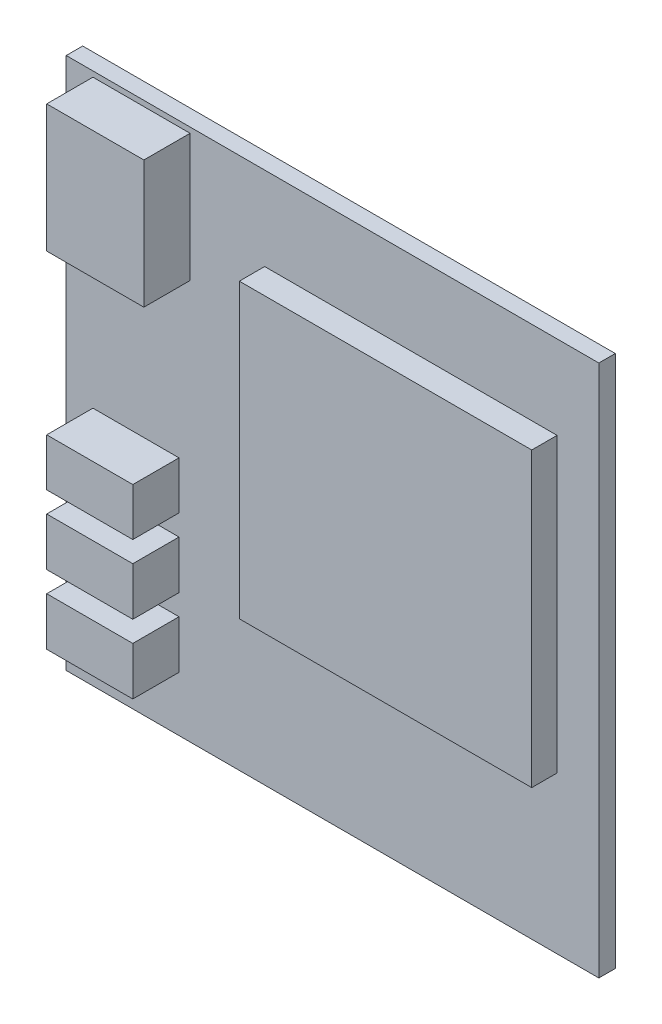
ISO-10303-21;
HEADER;
FILE_DESCRIPTION(('STEP AP214'),'2;1');
FILE_NAME('part.step','',(''),(''),'','','');
FILE_SCHEMA(('AUTOMOTIVE_DESIGN { 1 0 10303 214 1 1 1 1 }'));
ENDSEC;
DATA;
#1=APPLICATION_CONTEXT('core data for automotive mechanical design processes');
#2=APPLICATION_PROTOCOL_DEFINITION('international standard','automotive_design',2000,#1);
#3=PRODUCT_CONTEXT('',#1,'mechanical');
#4=PRODUCT('Part','Part','',(#3));
#5=PRODUCT_RELATED_PRODUCT_CATEGORY('part','',(#4));
#6=PRODUCT_DEFINITION_FORMATION('','',#4);
#7=PRODUCT_DEFINITION_CONTEXT('part definition',#1,'design');
#8=PRODUCT_DEFINITION('design','',#6,#7);
#9=PRODUCT_DEFINITION_SHAPE('','',#8);
#10=(LENGTH_UNIT() NAMED_UNIT(*) SI_UNIT(.MILLI.,.METRE.));
#11=(NAMED_UNIT(*) PLANE_ANGLE_UNIT() SI_UNIT($,.RADIAN.));
#12=(NAMED_UNIT(*) SI_UNIT($,.STERADIAN.) SOLID_ANGLE_UNIT());
#13=UNCERTAINTY_MEASURE_WITH_UNIT(LENGTH_MEASURE(1.E-05),#10,'distance_accuracy_value','');
#14=(GEOMETRIC_REPRESENTATION_CONTEXT(3) GLOBAL_UNCERTAINTY_ASSIGNED_CONTEXT((#13)) GLOBAL_UNIT_ASSIGNED_CONTEXT((#10,
#11,#12)) REPRESENTATION_CONTEXT('',''));
#15=CARTESIAN_POINT('',(0.,0.,0.));
#16=DIRECTION('',(0.,0.,1.));
#17=DIRECTION('',(1.,0.,0.));
#18=AXIS2_PLACEMENT_3D('',#15,#16,#17);
#19=CARTESIAN_POINT('',(0.,0.,1.5748));
#20=DIRECTION('',(0.,0.,-1.));
#21=DIRECTION('',(-1.,0.,0.));
#22=AXIS2_PLACEMENT_3D('',#19,#20,#21);
#23=PLANE('',#22);
#24=DIRECTION('',(0.,-1.,0.));
#25=VECTOR('',#24,1.);
#26=CARTESIAN_POINT('',(-22.94420982,-9.03028580000001,1.5748));
#27=LINE('',#26,#25);
#28=CARTESIAN_POINT('',(-22.94420982,-9.03028580000001,1.5748));
#29=VERTEX_POINT('',#28);
#30=CARTESIAN_POINT('',(-22.94420982,-13.64096184,1.5748));
#31=VERTEX_POINT('',#30);
#32=EDGE_CURVE('E326',#29,#31,#27,.T.);
#33=ORIENTED_EDGE('',*,*,#32,.F.);
#34=DIRECTION('',(-1.,0.,0.));
#35=VECTOR('',#34,1.);
#36=CARTESIAN_POINT('',(-22.94420982,-9.03028580000001,1.5748));
#37=LINE('',#36,#35);
#38=CARTESIAN_POINT('',(-14.70088982,-9.03028580000001,1.5748));
#39=VERTEX_POINT('',#38);
#40=EDGE_CURVE('E60',#39,#29,#37,.T.);
#41=ORIENTED_EDGE('',*,*,#40,.F.);
#42=DIRECTION('',(0.,1.,0.));
#43=VECTOR('',#42,1.);
#44=CARTESIAN_POINT('',(-14.70088982,-9.03028580000001,1.5748));
#45=LINE('',#44,#43);
#46=CARTESIAN_POINT('',(-14.70088982,-13.64096184,1.5748));
#47=VERTEX_POINT('',#46);
#48=EDGE_CURVE('E332',#47,#39,#45,.T.);
#49=ORIENTED_EDGE('',*,*,#48,.F.);
#50=DIRECTION('',(1.,0.,0.));
#51=VECTOR('',#50,1.);
#52=CARTESIAN_POINT('',(-22.94420982,-13.64096184,1.5748));
#53=LINE('',#52,#51);
#54=EDGE_CURVE('E329',#31,#47,#53,.T.);
#55=ORIENTED_EDGE('',*,*,#54,.F.);
#56=EDGE_LOOP('',(#33,#41,#49,#55));
#57=FACE_BOUND('',#56,.T.);
#58=DIRECTION('',(0.,-1.,0.));
#59=VECTOR('',#58,1.);
#60=CARTESIAN_POINT('',(-22.94420982,24.9789739644865,1.5748));
#61=LINE('',#60,#59);
#62=CARTESIAN_POINT('',(-22.94420982,24.9789739644865,1.5748));
#63=VERTEX_POINT('',#62);
#64=CARTESIAN_POINT('',(-22.94420982,12.7690269769403,1.5748));
#65=VERTEX_POINT('',#64);
#66=EDGE_CURVE('E347',#63,#65,#61,.T.);
#67=ORIENTED_EDGE('',*,*,#66,.F.);
#68=DIRECTION('',(-1.,0.,0.));
#69=VECTOR('',#68,1.);
#70=CARTESIAN_POINT('',(-22.94420982,24.9789739644865,1.5748));
#71=LINE('',#70,#69);
#72=CARTESIAN_POINT('',(-13.64142206,24.9789739644865,1.5748));
#73=VERTEX_POINT('',#72);
#74=EDGE_CURVE('E356',#73,#63,#71,.T.);
#75=ORIENTED_EDGE('',*,*,#74,.F.);
#76=DIRECTION('',(0.,1.,0.));
#77=VECTOR('',#76,1.);
#78=CARTESIAN_POINT('',(-13.64142206,24.9789739644865,1.5748));
#79=LINE('',#78,#77);
#80=CARTESIAN_POINT('',(-13.64142206,12.7690269769403,1.5748));
#81=VERTEX_POINT('',#80);
#82=EDGE_CURVE('E353',#81,#73,#79,.T.);
#83=ORIENTED_EDGE('',*,*,#82,.F.);
#84=DIRECTION('',(1.,0.,0.));
#85=VECTOR('',#84,1.);
#86=CARTESIAN_POINT('',(-22.94420982,12.7690269769403,1.5748));
#87=LINE('',#86,#85);
#88=EDGE_CURVE('E350',#65,#81,#87,.T.);
#89=ORIENTED_EDGE('',*,*,#88,.F.);
#90=EDGE_LOOP('',(#67,#75,#83,#89));
#91=FACE_BOUND('',#90,.T.);
#92=DIRECTION('',(0.,1.,0.));
#93=VECTOR('',#92,1.);
#94=CARTESIAN_POINT('',(25.5,-25.5,1.5748));
#95=LINE('',#94,#93);
#96=CARTESIAN_POINT('',(25.5,-25.5,1.5748));
#97=VERTEX_POINT('',#96);
#98=CARTESIAN_POINT('',(25.5,25.5,1.5748));
#99=VERTEX_POINT('',#98);
#100=EDGE_CURVE('E372',#97,#99,#95,.T.);
#101=ORIENTED_EDGE('',*,*,#100,.T.);
#102=DIRECTION('',(-1.,0.,0.));
#103=VECTOR('',#102,1.);
#104=CARTESIAN_POINT('',(-25.5,25.5,1.5748));
#105=LINE('',#104,#103);
#106=CARTESIAN_POINT('',(-25.5,25.5,1.5748));
#107=VERTEX_POINT('',#106);
#108=EDGE_CURVE('E375',#99,#107,#105,.T.);
#109=ORIENTED_EDGE('',*,*,#108,.T.);
#110=DIRECTION('',(0.,-1.,0.));
#111=VECTOR('',#110,1.);
#112=CARTESIAN_POINT('',(-25.5,-25.5,1.5748));
#113=LINE('',#112,#111);
#114=CARTESIAN_POINT('',(-25.5,-25.5,1.5748));
#115=VERTEX_POINT('',#114);
#116=EDGE_CURVE('E378',#107,#115,#113,.T.);
#117=ORIENTED_EDGE('',*,*,#116,.T.);
#118=DIRECTION('',(1.,0.,0.));
#119=VECTOR('',#118,1.);
#120=CARTESIAN_POINT('',(-25.5,-25.5,1.5748));
#121=LINE('',#120,#119);
#122=EDGE_CURVE('E380',#115,#97,#121,.T.);
#123=ORIENTED_EDGE('',*,*,#122,.T.);
#124=EDGE_LOOP('',(#101,#109,#117,#123));
#125=FACE_BOUND('',#124,.T.);
#126=DIRECTION('',(0.,-1.,0.));
#127=VECTOR('',#126,1.);
#128=CARTESIAN_POINT('',(-6.49999999999999,17.5,1.5748));
#129=LINE('',#128,#127);
#130=CARTESIAN_POINT('',(-6.49999999999999,17.5,1.5748));
#131=VERTEX_POINT('',#130);
#132=CARTESIAN_POINT('',(-6.49999999999999,-10.5,1.5748));
#133=VERTEX_POINT('',#132);
#134=EDGE_CURVE('E359',#131,#133,#129,.T.);
#135=ORIENTED_EDGE('',*,*,#134,.F.);
#136=DIRECTION('',(-1.,0.,0.));
#137=VECTOR('',#136,1.);
#138=CARTESIAN_POINT('',(-6.49999999999999,17.5,1.5748));
#139=LINE('',#138,#137);
#140=CARTESIAN_POINT('',(21.5,17.5,1.5748));
#141=VERTEX_POINT('',#140);
#142=EDGE_CURVE('E368',#141,#131,#139,.T.);
#143=ORIENTED_EDGE('',*,*,#142,.F.);
#144=DIRECTION('',(0.,1.,0.));
#145=VECTOR('',#144,1.);
#146=CARTESIAN_POINT('',(21.5,17.5,1.5748));
#147=LINE('',#146,#145);
#148=CARTESIAN_POINT('',(21.5,-10.5,1.5748));
#149=VERTEX_POINT('',#148);
#150=EDGE_CURVE('E365',#149,#141,#147,.T.);
#151=ORIENTED_EDGE('',*,*,#150,.F.);
#152=DIRECTION('',(1.,0.,0.));
#153=VECTOR('',#152,1.);
#154=CARTESIAN_POINT('',(-6.49999999999999,-10.5,1.5748));
#155=LINE('',#154,#153);
#156=EDGE_CURVE('E362',#133,#149,#155,.T.);
#157=ORIENTED_EDGE('',*,*,#156,.F.);
#158=EDGE_LOOP('',(#135,#143,#151,#157));
#159=FACE_BOUND('',#158,.T.);
#160=DIRECTION('',(0.,-1.,0.));
#161=VECTOR('',#160,1.);
#162=CARTESIAN_POINT('',(-22.94420982,-2.46672042000001,1.5748));
#163=LINE('',#162,#161);
#164=CARTESIAN_POINT('',(-22.94420982,-2.46672042000001,1.5748));
#165=VERTEX_POINT('',#164);
#166=CARTESIAN_POINT('',(-22.94420982,-7.03028580000001,1.5748));
#167=VERTEX_POINT('',#166);
#168=EDGE_CURVE('E335',#165,#167,#163,.T.);
#169=ORIENTED_EDGE('',*,*,#168,.F.);
#170=DIRECTION('',(-1.,0.,0.));
#171=VECTOR('',#170,1.);
#172=CARTESIAN_POINT('',(-22.94420982,-2.46672042000001,1.5748));
#173=LINE('',#172,#171);
#174=CARTESIAN_POINT('',(-14.70088982,-2.46672042000001,1.5748));
#175=VERTEX_POINT('',#174);
#176=EDGE_CURVE('E344',#175,#165,#173,.T.);
#177=ORIENTED_EDGE('',*,*,#176,.F.);
#178=DIRECTION('',(0.,1.,0.));
#179=VECTOR('',#178,1.);
#180=CARTESIAN_POINT('',(-14.70088982,-2.46672042000001,1.5748));
#181=LINE('',#180,#179);
#182=CARTESIAN_POINT('',(-14.70088982,-7.03028580000001,1.5748));
#183=VERTEX_POINT('',#182);
#184=EDGE_CURVE('E341',#183,#175,#181,.T.);
#185=ORIENTED_EDGE('',*,*,#184,.F.);
#186=DIRECTION('',(1.,0.,0.));
#187=VECTOR('',#186,1.);
#188=CARTESIAN_POINT('',(-22.94420982,-7.03028580000001,1.5748));
#189=LINE('',#188,#187);
#190=EDGE_CURVE('E338',#167,#183,#189,.T.);
#191=ORIENTED_EDGE('',*,*,#190,.F.);
#192=EDGE_LOOP('',(#169,#177,#185,#191));
#193=FACE_BOUND('',#192,.T.);
#194=DIRECTION('',(0.,-1.,0.));
#195=VECTOR('',#194,1.);
#196=CARTESIAN_POINT('',(-22.94420982,-15.64096184,1.5748));
#197=LINE('',#196,#195);
#198=CARTESIAN_POINT('',(-22.94420982,-15.64096184,1.5748));
#199=VERTEX_POINT('',#198);
#200=CARTESIAN_POINT('',(-22.94420982,-20.25163788,1.5748));
#201=VERTEX_POINT('',#200);
#202=EDGE_CURVE('E318',#199,#201,#197,.T.);
#203=ORIENTED_EDGE('',*,*,#202,.F.);
#204=DIRECTION('',(-1.,0.,0.));
#205=VECTOR('',#204,1.);
#206=CARTESIAN_POINT('',(-22.94420982,-15.64096184,1.5748));
#207=LINE('',#206,#205);
#208=CARTESIAN_POINT('',(-14.70088982,-15.64096184,1.5748));
#209=VERTEX_POINT('',#208);
#210=EDGE_CURVE('E52',#209,#199,#207,.T.);
#211=ORIENTED_EDGE('',*,*,#210,.F.);
#212=DIRECTION('',(0.,1.,0.));
#213=VECTOR('',#212,1.);
#214=CARTESIAN_POINT('',(-14.70088982,-15.64096184,1.5748));
#215=LINE('',#214,#213);
#216=CARTESIAN_POINT('',(-14.70088982,-20.25163788,1.5748));
#217=VERTEX_POINT('',#216);
#218=EDGE_CURVE('E203',#217,#209,#215,.T.);
#219=ORIENTED_EDGE('',*,*,#218,.F.);
#220=DIRECTION('',(1.,0.,0.));
#221=VECTOR('',#220,1.);
#222=CARTESIAN_POINT('',(-22.94420982,-20.25163788,1.5748));
#223=LINE('',#222,#221);
#224=EDGE_CURVE('E321',#201,#217,#223,.T.);
#225=ORIENTED_EDGE('',*,*,#224,.F.);
#226=EDGE_LOOP('',(#203,#211,#219,#225));
#227=FACE_BOUND('',#226,.T.);
#228=ADVANCED_FACE('F37',(#57,#91,#125,#159,#193,#227),#23,.F.);
#229=CARTESIAN_POINT('',(0.,0.,0.));
#230=DIRECTION('',(0.,0.,-1.));
#231=DIRECTION('',(-1.,0.,0.));
#232=AXIS2_PLACEMENT_3D('',#229,#230,#231);
#233=PLANE('',#232);
#234=DIRECTION('',(0.,1.,0.));
#235=VECTOR('',#234,1.);
#236=CARTESIAN_POINT('',(25.5,-25.5,0.));
#237=LINE('',#236,#235);
#238=CARTESIAN_POINT('',(25.5,-25.5,0.));
#239=VERTEX_POINT('',#238);
#240=CARTESIAN_POINT('',(25.5,25.5,0.));
#241=VERTEX_POINT('',#240);
#242=EDGE_CURVE('E371',#239,#241,#237,.T.);
#243=ORIENTED_EDGE('',*,*,#242,.F.);
#244=DIRECTION('',(1.,0.,0.));
#245=VECTOR('',#244,1.);
#246=CARTESIAN_POINT('',(-25.5,-25.5,0.));
#247=LINE('',#246,#245);
#248=CARTESIAN_POINT('',(-25.5,-25.5,0.));
#249=VERTEX_POINT('',#248);
#250=EDGE_CURVE('E376',#249,#239,#247,.T.);
#251=ORIENTED_EDGE('',*,*,#250,.F.);
#252=DIRECTION('',(0.,-1.,0.));
#253=VECTOR('',#252,1.);
#254=CARTESIAN_POINT('',(-25.5,-25.5,0.));
#255=LINE('',#254,#253);
#256=CARTESIAN_POINT('',(-25.5,25.5,0.));
#257=VERTEX_POINT('',#256);
#258=EDGE_CURVE('E387',#257,#249,#255,.T.);
#259=ORIENTED_EDGE('',*,*,#258,.F.);
#260=DIRECTION('',(-1.,0.,0.));
#261=VECTOR('',#260,1.);
#262=CARTESIAN_POINT('',(-25.5,25.5,0.));
#263=LINE('',#262,#261);
#264=EDGE_CURVE('E385',#241,#257,#263,.T.);
#265=ORIENTED_EDGE('',*,*,#264,.F.);
#266=EDGE_LOOP('',(#243,#251,#259,#265));
#267=FACE_BOUND('',#266,.T.);
#268=ADVANCED_FACE('F405',(#267),#233,.T.);
#269=CARTESIAN_POINT('',(25.5,-25.5,1.5748));
#270=DIRECTION('',(-1.,0.,0.));
#271=DIRECTION('',(0.,0.,1.));
#272=AXIS2_PLACEMENT_3D('',#269,#270,#271);
#273=PLANE('',#272);
#274=ORIENTED_EDGE('',*,*,#242,.T.);
#275=DIRECTION('',(0.,0.,-1.));
#276=VECTOR('',#275,1.);
#277=CARTESIAN_POINT('',(25.5,25.5,1.5748));
#278=LINE('',#277,#276);
#279=EDGE_CURVE('E11',#99,#241,#278,.T.);
#280=ORIENTED_EDGE('',*,*,#279,.F.);
#281=ORIENTED_EDGE('',*,*,#100,.F.);
#282=DIRECTION('',(0.,0.,-1.));
#283=VECTOR('',#282,1.);
#284=CARTESIAN_POINT('',(25.5,-25.5,1.5748));
#285=LINE('',#284,#283);
#286=EDGE_CURVE('E382',#97,#239,#285,.T.);
#287=ORIENTED_EDGE('',*,*,#286,.T.);
#288=EDGE_LOOP('',(#274,#280,#281,#287));
#289=FACE_BOUND('',#288,.T.);
#290=ADVANCED_FACE('F39',(#289),#273,.F.);
#291=CARTESIAN_POINT('',(-25.5,25.5,1.5748));
#292=DIRECTION('',(0.,-1.,0.));
#293=DIRECTION('',(0.,0.,-1.));
#294=AXIS2_PLACEMENT_3D('',#291,#292,#293);
#295=PLANE('',#294);
#296=ORIENTED_EDGE('',*,*,#264,.T.);
#297=DIRECTION('',(0.,0.,-1.));
#298=VECTOR('',#297,1.);
#299=CARTESIAN_POINT('',(-25.5,25.5,1.5748));
#300=LINE('',#299,#298);
#301=EDGE_CURVE('E45',#107,#257,#300,.T.);
#302=ORIENTED_EDGE('',*,*,#301,.F.);
#303=ORIENTED_EDGE('',*,*,#108,.F.);
#304=ORIENTED_EDGE('',*,*,#279,.T.);
#305=EDGE_LOOP('',(#296,#302,#303,#304));
#306=FACE_BOUND('',#305,.T.);
#307=ADVANCED_FACE('F415',(#306),#295,.F.);
#308=CARTESIAN_POINT('',(-25.5,-25.5,1.5748));
#309=DIRECTION('',(1.,0.,0.));
#310=DIRECTION('',(0.,0.,-1.));
#311=AXIS2_PLACEMENT_3D('',#308,#309,#310);
#312=PLANE('',#311);
#313=ORIENTED_EDGE('',*,*,#258,.T.);
#314=DIRECTION('',(0.,0.,-1.));
#315=VECTOR('',#314,1.);
#316=CARTESIAN_POINT('',(-25.5,-25.5,1.5748));
#317=LINE('',#316,#315);
#318=EDGE_CURVE('E392',#115,#249,#317,.T.);
#319=ORIENTED_EDGE('',*,*,#318,.F.);
#320=ORIENTED_EDGE('',*,*,#116,.F.);
#321=ORIENTED_EDGE('',*,*,#301,.T.);
#322=EDGE_LOOP('',(#313,#319,#320,#321));
#323=FACE_BOUND('',#322,.T.);
#324=ADVANCED_FACE('F399',(#323),#312,.F.);
#325=CARTESIAN_POINT('',(-25.5,-25.5,1.5748));
#326=DIRECTION('',(0.,1.,0.));
#327=DIRECTION('',(0.,0.,1.));
#328=AXIS2_PLACEMENT_3D('',#325,#326,#327);
#329=PLANE('',#328);
#330=ORIENTED_EDGE('',*,*,#250,.T.);
#331=ORIENTED_EDGE('',*,*,#286,.F.);
#332=ORIENTED_EDGE('',*,*,#122,.F.);
#333=ORIENTED_EDGE('',*,*,#318,.T.);
#334=EDGE_LOOP('',(#330,#331,#332,#333));
#335=FACE_BOUND('',#334,.T.);
#336=ADVANCED_FACE('F408',(#335),#329,.F.);
#337=CARTESIAN_POINT('',(0.,17.5,4.));
#338=DIRECTION('',(0.,1.,0.));
#339=DIRECTION('',(0.,0.,1.));
#340=AXIS2_PLACEMENT_3D('',#337,#338,#339);
#341=PLANE('',#340);
#342=ORIENTED_EDGE('',*,*,#142,.T.);
#343=DIRECTION('',(0.,0.,-1.));
#344=VECTOR('',#343,1.);
#345=CARTESIAN_POINT('',(-6.49999999999999,17.5,4.));
#346=LINE('',#345,#344);
#347=CARTESIAN_POINT('',(-6.49999999999999,17.5,4.));
#348=VERTEX_POINT('',#347);
#349=EDGE_CURVE('E312',#348,#131,#346,.T.);
#350=ORIENTED_EDGE('',*,*,#349,.F.);
#351=DIRECTION('',(1.,0.,0.));
#352=VECTOR('',#351,1.);
#353=CARTESIAN_POINT('',(0.,17.5,4.));
#354=LINE('',#353,#352);
#355=CARTESIAN_POINT('',(21.5,17.5,4.));
#356=VERTEX_POINT('',#355);
#357=EDGE_CURVE('E299',#348,#356,#354,.T.);
#358=ORIENTED_EDGE('',*,*,#357,.T.);
#359=DIRECTION('',(0.,0.,-1.));
#360=VECTOR('',#359,1.);
#361=CARTESIAN_POINT('',(21.5,17.5,4.));
#362=LINE('',#361,#360);
#363=EDGE_CURVE('E315',#356,#141,#362,.T.);
#364=ORIENTED_EDGE('',*,*,#363,.T.);
#365=EDGE_LOOP('',(#342,#350,#358,#364));
#366=FACE_BOUND('',#365,.T.);
#367=ADVANCED_FACE('F434',(#366),#341,.T.);
#368=CARTESIAN_POINT('',(0.,-10.5,4.));
#369=DIRECTION('',(0.,1.,0.));
#370=DIRECTION('',(0.,0.,1.));
#371=AXIS2_PLACEMENT_3D('',#368,#369,#370);
#372=PLANE('',#371);
#373=DIRECTION('',(0.,0.,-1.));
#374=VECTOR('',#373,1.);
#375=CARTESIAN_POINT('',(-6.49999999999999,-10.5,4.));
#376=LINE('',#375,#374);
#377=CARTESIAN_POINT('',(-6.49999999999999,-10.5,4.));
#378=VERTEX_POINT('',#377);
#379=EDGE_CURVE('E309',#378,#133,#376,.T.);
#380=ORIENTED_EDGE('',*,*,#379,.T.);
#381=ORIENTED_EDGE('',*,*,#156,.T.);
#382=DIRECTION('',(0.,0.,-1.));
#383=VECTOR('',#382,1.);
#384=CARTESIAN_POINT('',(21.5,-10.5,4.));
#385=LINE('',#384,#383);
#386=CARTESIAN_POINT('',(21.5,-10.5,4.));
#387=VERTEX_POINT('',#386);
#388=EDGE_CURVE('E306',#387,#149,#385,.T.);
#389=ORIENTED_EDGE('',*,*,#388,.F.);
#390=DIRECTION('',(1.,0.,0.));
#391=VECTOR('',#390,1.);
#392=CARTESIAN_POINT('',(0.,-10.5,4.));
#393=LINE('',#392,#391);
#394=EDGE_CURVE('E304',#378,#387,#393,.T.);
#395=ORIENTED_EDGE('',*,*,#394,.F.);
#396=EDGE_LOOP('',(#380,#381,#389,#395));
#397=FACE_BOUND('',#396,.T.);
#398=ADVANCED_FACE('F438',(#397),#372,.F.);
#399=CARTESIAN_POINT('',(21.5,0.,4.));
#400=DIRECTION('',(1.,0.,0.));
#401=DIRECTION('',(0.,1.,0.));
#402=AXIS2_PLACEMENT_3D('',#399,#400,#401);
#403=PLANE('',#402);
#404=ORIENTED_EDGE('',*,*,#150,.T.);
#405=ORIENTED_EDGE('',*,*,#363,.F.);
#406=DIRECTION('',(0.,-1.,0.));
#407=VECTOR('',#406,1.);
#408=CARTESIAN_POINT('',(21.5,0.,4.));
#409=LINE('',#408,#407);
#410=EDGE_CURVE('E296',#356,#387,#409,.T.);
#411=ORIENTED_EDGE('',*,*,#410,.T.);
#412=ORIENTED_EDGE('',*,*,#388,.T.);
#413=EDGE_LOOP('',(#404,#405,#411,#412));
#414=FACE_BOUND('',#413,.T.);
#415=ADVANCED_FACE('F430',(#414),#403,.T.);
#416=CARTESIAN_POINT('',(-6.49999999999999,0.,4.));
#417=DIRECTION('',(1.,0.,0.));
#418=DIRECTION('',(0.,1.,0.));
#419=AXIS2_PLACEMENT_3D('',#416,#417,#418);
#420=PLANE('',#419);
#421=ORIENTED_EDGE('',*,*,#349,.T.);
#422=ORIENTED_EDGE('',*,*,#134,.T.);
#423=ORIENTED_EDGE('',*,*,#379,.F.);
#424=DIRECTION('',(0.,-1.,0.));
#425=VECTOR('',#424,1.);
#426=CARTESIAN_POINT('',(-6.49999999999999,0.,4.));
#427=LINE('',#426,#425);
#428=EDGE_CURVE('E302',#348,#378,#427,.T.);
#429=ORIENTED_EDGE('',*,*,#428,.F.);
#430=EDGE_LOOP('',(#421,#422,#423,#429));
#431=FACE_BOUND('',#430,.T.);
#432=ADVANCED_FACE('F446',(#431),#420,.F.);
#433=CARTESIAN_POINT('',(0.,0.,4.));
#434=DIRECTION('',(0.,0.,1.));
#435=DIRECTION('',(1.,0.,0.));
#436=AXIS2_PLACEMENT_3D('',#433,#434,#435);
#437=PLANE('',#436);
#438=ORIENTED_EDGE('',*,*,#410,.F.);
#439=ORIENTED_EDGE('',*,*,#357,.F.);
#440=ORIENTED_EDGE('',*,*,#428,.T.);
#441=ORIENTED_EDGE('',*,*,#394,.T.);
#442=EDGE_LOOP('',(#438,#439,#440,#441));
#443=FACE_BOUND('',#442,.T.);
#444=ADVANCED_FACE('F448',(#443),#437,.T.);
#445=CARTESIAN_POINT('',(0.,24.9789739644865,6.));
#446=DIRECTION('',(0.,1.,0.));
#447=DIRECTION('',(0.,0.,1.));
#448=AXIS2_PLACEMENT_3D('',#445,#446,#447);
#449=PLANE('',#448);
#450=ORIENTED_EDGE('',*,*,#74,.T.);
#451=DIRECTION('',(0.,0.,-1.));
#452=VECTOR('',#451,1.);
#453=CARTESIAN_POINT('',(-22.94420982,24.9789739644865,6.));
#454=LINE('',#453,#452);
#455=CARTESIAN_POINT('',(-22.94420982,24.9789739644865,6.));
#456=VERTEX_POINT('',#455);
#457=EDGE_CURVE('E290',#456,#63,#454,.T.);
#458=ORIENTED_EDGE('',*,*,#457,.F.);
#459=DIRECTION('',(1.,0.,0.));
#460=VECTOR('',#459,1.);
#461=CARTESIAN_POINT('',(0.,24.9789739644865,6.));
#462=LINE('',#461,#460);
#463=CARTESIAN_POINT('',(-13.64142206,24.9789739644865,6.));
#464=VERTEX_POINT('',#463);
#465=EDGE_CURVE('E277',#456,#464,#462,.T.);
#466=ORIENTED_EDGE('',*,*,#465,.T.);
#467=DIRECTION('',(0.,0.,-1.));
#468=VECTOR('',#467,1.);
#469=CARTESIAN_POINT('',(-13.64142206,24.9789739644865,6.));
#470=LINE('',#469,#468);
#471=EDGE_CURVE('E293',#464,#73,#470,.T.);
#472=ORIENTED_EDGE('',*,*,#471,.T.);
#473=EDGE_LOOP('',(#450,#458,#466,#472));
#474=FACE_BOUND('',#473,.T.);
#475=ADVANCED_FACE('F453',(#474),#449,.T.);
#476=CARTESIAN_POINT('',(0.,12.7690269769403,6.));
#477=DIRECTION('',(0.,1.,0.));
#478=DIRECTION('',(0.,0.,1.));
#479=AXIS2_PLACEMENT_3D('',#476,#477,#478);
#480=PLANE('',#479);
#481=DIRECTION('',(0.,0.,-1.));
#482=VECTOR('',#481,1.);
#483=CARTESIAN_POINT('',(-22.94420982,12.7690269769403,6.));
#484=LINE('',#483,#482);
#485=CARTESIAN_POINT('',(-22.94420982,12.7690269769403,6.));
#486=VERTEX_POINT('',#485);
#487=EDGE_CURVE('E287',#486,#65,#484,.T.);
#488=ORIENTED_EDGE('',*,*,#487,.T.);
#489=ORIENTED_EDGE('',*,*,#88,.T.);
#490=DIRECTION('',(0.,0.,-1.));
#491=VECTOR('',#490,1.);
#492=CARTESIAN_POINT('',(-13.64142206,12.7690269769403,6.));
#493=LINE('',#492,#491);
#494=CARTESIAN_POINT('',(-13.64142206,12.7690269769403,6.));
#495=VERTEX_POINT('',#494);
#496=EDGE_CURVE('E284',#495,#81,#493,.T.);
#497=ORIENTED_EDGE('',*,*,#496,.F.);
#498=DIRECTION('',(1.,0.,0.));
#499=VECTOR('',#498,1.);
#500=CARTESIAN_POINT('',(0.,12.7690269769403,6.));
#501=LINE('',#500,#499);
#502=EDGE_CURVE('E282',#486,#495,#501,.T.);
#503=ORIENTED_EDGE('',*,*,#502,.F.);
#504=EDGE_LOOP('',(#488,#489,#497,#503));
#505=FACE_BOUND('',#504,.T.);
#506=ADVANCED_FACE('F459',(#505),#480,.F.);
#507=CARTESIAN_POINT('',(-13.64142206,0.,6.));
#508=DIRECTION('',(1.,0.,0.));
#509=DIRECTION('',(0.,1.,0.));
#510=AXIS2_PLACEMENT_3D('',#507,#508,#509);
#511=PLANE('',#510);
#512=ORIENTED_EDGE('',*,*,#82,.T.);
#513=ORIENTED_EDGE('',*,*,#471,.F.);
#514=DIRECTION('',(0.,-1.,0.));
#515=VECTOR('',#514,1.);
#516=CARTESIAN_POINT('',(-13.64142206,0.,6.));
#517=LINE('',#516,#515);
#518=EDGE_CURVE('E274',#464,#495,#517,.T.);
#519=ORIENTED_EDGE('',*,*,#518,.T.);
#520=ORIENTED_EDGE('',*,*,#496,.T.);
#521=EDGE_LOOP('',(#512,#513,#519,#520));
#522=FACE_BOUND('',#521,.T.);
#523=ADVANCED_FACE('F455',(#522),#511,.T.);
#524=CARTESIAN_POINT('',(-22.94420982,0.,6.));
#525=DIRECTION('',(1.,0.,0.));
#526=DIRECTION('',(0.,0.,-1.));
#527=AXIS2_PLACEMENT_3D('',#524,#525,#526);
#528=PLANE('',#527);
#529=ORIENTED_EDGE('',*,*,#457,.T.);
#530=ORIENTED_EDGE('',*,*,#66,.T.);
#531=ORIENTED_EDGE('',*,*,#487,.F.);
#532=DIRECTION('',(0.,-1.,0.));
#533=VECTOR('',#532,1.);
#534=CARTESIAN_POINT('',(-22.94420982,0.,6.));
#535=LINE('',#534,#533);
#536=EDGE_CURVE('E280',#456,#486,#535,.T.);
#537=ORIENTED_EDGE('',*,*,#536,.F.);
#538=EDGE_LOOP('',(#529,#530,#531,#537));
#539=FACE_BOUND('',#538,.T.);
#540=ADVANCED_FACE('F458',(#539),#528,.F.);
#541=CARTESIAN_POINT('',(0.,0.,6.));
#542=DIRECTION('',(0.,0.,1.));
#543=DIRECTION('',(1.,0.,0.));
#544=AXIS2_PLACEMENT_3D('',#541,#542,#543);
#545=PLANE('',#544);
#546=ORIENTED_EDGE('',*,*,#518,.F.);
#547=ORIENTED_EDGE('',*,*,#465,.F.);
#548=ORIENTED_EDGE('',*,*,#536,.T.);
#549=ORIENTED_EDGE('',*,*,#502,.T.);
#550=EDGE_LOOP('',(#546,#547,#548,#549));
#551=FACE_BOUND('',#550,.T.);
#552=ADVANCED_FACE('F466',(#551),#545,.T.);
#553=CARTESIAN_POINT('',(0.,-2.46672042000001,6.));
#554=DIRECTION('',(0.,1.,0.));
#555=DIRECTION('',(-1.,0.,0.));
#556=AXIS2_PLACEMENT_3D('',#553,#554,#555);
#557=PLANE('',#556);
#558=ORIENTED_EDGE('',*,*,#176,.T.);
#559=DIRECTION('',(0.,0.,-1.));
#560=VECTOR('',#559,1.);
#561=CARTESIAN_POINT('',(-22.94420982,-2.46672042000001,6.));
#562=LINE('',#561,#560);
#563=CARTESIAN_POINT('',(-22.94420982,-2.46672042000001,6.));
#564=VERTEX_POINT('',#563);
#565=EDGE_CURVE('E268',#564,#165,#562,.T.);
#566=ORIENTED_EDGE('',*,*,#565,.F.);
#567=DIRECTION('',(1.,0.,0.));
#568=VECTOR('',#567,1.);
#569=CARTESIAN_POINT('',(0.,-2.46672042000001,6.));
#570=LINE('',#569,#568);
#571=CARTESIAN_POINT('',(-14.70088982,-2.46672042000001,6.));
#572=VERTEX_POINT('',#571);
#573=EDGE_CURVE('E255',#564,#572,#570,.T.);
#574=ORIENTED_EDGE('',*,*,#573,.T.);
#575=DIRECTION('',(0.,0.,-1.));
#576=VECTOR('',#575,1.);
#577=CARTESIAN_POINT('',(-14.70088982,-2.46672042000001,6.));
#578=LINE('',#577,#576);
#579=EDGE_CURVE('E271',#572,#175,#578,.T.);
#580=ORIENTED_EDGE('',*,*,#579,.T.);
#581=EDGE_LOOP('',(#558,#566,#574,#580));
#582=FACE_BOUND('',#581,.T.);
#583=ADVANCED_FACE('F473',(#582),#557,.T.);
#584=CARTESIAN_POINT('',(0.,-7.03028580000001,6.));
#585=DIRECTION('',(0.,1.,0.));
#586=DIRECTION('',(0.,0.,1.));
#587=AXIS2_PLACEMENT_3D('',#584,#585,#586);
#588=PLANE('',#587);
#589=DIRECTION('',(0.,0.,-1.));
#590=VECTOR('',#589,1.);
#591=CARTESIAN_POINT('',(-22.94420982,-7.03028580000001,6.));
#592=LINE('',#591,#590);
#593=CARTESIAN_POINT('',(-22.94420982,-7.03028580000001,6.));
#594=VERTEX_POINT('',#593);
#595=EDGE_CURVE('E265',#594,#167,#592,.T.);
#596=ORIENTED_EDGE('',*,*,#595,.T.);
#597=ORIENTED_EDGE('',*,*,#190,.T.);
#598=DIRECTION('',(0.,0.,-1.));
#599=VECTOR('',#598,1.);
#600=CARTESIAN_POINT('',(-14.70088982,-7.03028580000001,6.));
#601=LINE('',#600,#599);
#602=CARTESIAN_POINT('',(-14.70088982,-7.03028580000001,6.));
#603=VERTEX_POINT('',#602);
#604=EDGE_CURVE('E262',#603,#183,#601,.T.);
#605=ORIENTED_EDGE('',*,*,#604,.F.);
#606=DIRECTION('',(1.,0.,0.));
#607=VECTOR('',#606,1.);
#608=CARTESIAN_POINT('',(0.,-7.03028580000001,6.));
#609=LINE('',#608,#607);
#610=EDGE_CURVE('E260',#594,#603,#609,.T.);
#611=ORIENTED_EDGE('',*,*,#610,.F.);
#612=EDGE_LOOP('',(#596,#597,#605,#611));
#613=FACE_BOUND('',#612,.T.);
#614=ADVANCED_FACE('F479',(#613),#588,.F.);
#615=CARTESIAN_POINT('',(-14.70088982,0.,6.));
#616=DIRECTION('',(1.,0.,0.));
#617=DIRECTION('',(0.,0.,-1.));
#618=AXIS2_PLACEMENT_3D('',#615,#616,#617);
#619=PLANE('',#618);
#620=ORIENTED_EDGE('',*,*,#184,.T.);
#621=ORIENTED_EDGE('',*,*,#579,.F.);
#622=DIRECTION('',(0.,-1.,0.));
#623=VECTOR('',#622,1.);
#624=CARTESIAN_POINT('',(-14.70088982,0.,6.));
#625=LINE('',#624,#623);
#626=EDGE_CURVE('E252',#572,#603,#625,.T.);
#627=ORIENTED_EDGE('',*,*,#626,.T.);
#628=ORIENTED_EDGE('',*,*,#604,.T.);
#629=EDGE_LOOP('',(#620,#621,#627,#628));
#630=FACE_BOUND('',#629,.T.);
#631=ADVANCED_FACE('F475',(#630),#619,.T.);
#632=CARTESIAN_POINT('',(-22.94420982,0.,6.));
#633=DIRECTION('',(1.,0.,0.));
#634=DIRECTION('',(0.,0.,-1.));
#635=AXIS2_PLACEMENT_3D('',#632,#633,#634);
#636=PLANE('',#635);
#637=ORIENTED_EDGE('',*,*,#565,.T.);
#638=ORIENTED_EDGE('',*,*,#168,.T.);
#639=ORIENTED_EDGE('',*,*,#595,.F.);
#640=DIRECTION('',(0.,-1.,0.));
#641=VECTOR('',#640,1.);
#642=CARTESIAN_POINT('',(-22.94420982,0.,6.));
#643=LINE('',#642,#641);
#644=EDGE_CURVE('E258',#564,#594,#643,.T.);
#645=ORIENTED_EDGE('',*,*,#644,.F.);
#646=EDGE_LOOP('',(#637,#638,#639,#645));
#647=FACE_BOUND('',#646,.T.);
#648=ADVANCED_FACE('F478',(#647),#636,.F.);
#649=CARTESIAN_POINT('',(0.,0.,6.));
#650=DIRECTION('',(0.,0.,1.));
#651=DIRECTION('',(1.,0.,0.));
#652=AXIS2_PLACEMENT_3D('',#649,#650,#651);
#653=PLANE('',#652);
#654=ORIENTED_EDGE('',*,*,#626,.F.);
#655=ORIENTED_EDGE('',*,*,#573,.F.);
#656=ORIENTED_EDGE('',*,*,#644,.T.);
#657=ORIENTED_EDGE('',*,*,#610,.T.);
#658=EDGE_LOOP('',(#654,#655,#656,#657));
#659=FACE_BOUND('',#658,.T.);
#660=ADVANCED_FACE('F486',(#659),#653,.T.);
#661=CARTESIAN_POINT('',(0.,-9.03028580000001,6.));
#662=DIRECTION('',(0.,1.,0.));
#663=DIRECTION('',(0.,0.,1.));
#664=AXIS2_PLACEMENT_3D('',#661,#662,#663);
#665=PLANE('',#664);
#666=ORIENTED_EDGE('',*,*,#40,.T.);
#667=DIRECTION('',(0.,0.,-1.));
#668=VECTOR('',#667,1.);
#669=CARTESIAN_POINT('',(-22.94420982,-9.03028580000001,6.));
#670=LINE('',#669,#668);
#671=CARTESIAN_POINT('',(-22.94420982,-9.03028580000001,6.));
#672=VERTEX_POINT('',#671);
#673=EDGE_CURVE('E246',#672,#29,#670,.T.);
#674=ORIENTED_EDGE('',*,*,#673,.F.);
#675=DIRECTION('',(1.,0.,0.));
#676=VECTOR('',#675,1.);
#677=CARTESIAN_POINT('',(0.,-9.03028580000001,6.));
#678=LINE('',#677,#676);
#679=CARTESIAN_POINT('',(-14.70088982,-9.03028580000001,6.));
#680=VERTEX_POINT('',#679);
#681=EDGE_CURVE('E233',#672,#680,#678,.T.);
#682=ORIENTED_EDGE('',*,*,#681,.T.);
#683=DIRECTION('',(0.,0.,-1.));
#684=VECTOR('',#683,1.);
#685=CARTESIAN_POINT('',(-14.70088982,-9.03028580000001,6.));
#686=LINE('',#685,#684);
#687=EDGE_CURVE('E249',#680,#39,#686,.T.);
#688=ORIENTED_EDGE('',*,*,#687,.T.);
#689=EDGE_LOOP('',(#666,#674,#682,#688));
#690=FACE_BOUND('',#689,.T.);
#691=ADVANCED_FACE('F493',(#690),#665,.T.);
#692=CARTESIAN_POINT('',(0.,-13.64096184,6.));
#693=DIRECTION('',(0.,1.,0.));
#694=DIRECTION('',(0.,0.,1.));
#695=AXIS2_PLACEMENT_3D('',#692,#693,#694);
#696=PLANE('',#695);
#697=DIRECTION('',(0.,0.,-1.));
#698=VECTOR('',#697,1.);
#699=CARTESIAN_POINT('',(-22.94420982,-13.64096184,6.));
#700=LINE('',#699,#698);
#701=CARTESIAN_POINT('',(-22.94420982,-13.64096184,6.));
#702=VERTEX_POINT('',#701);
#703=EDGE_CURVE('E243',#702,#31,#700,.T.);
#704=ORIENTED_EDGE('',*,*,#703,.T.);
#705=ORIENTED_EDGE('',*,*,#54,.T.);
#706=DIRECTION('',(0.,0.,-1.));
#707=VECTOR('',#706,1.);
#708=CARTESIAN_POINT('',(-14.70088982,-13.64096184,6.));
#709=LINE('',#708,#707);
#710=CARTESIAN_POINT('',(-14.70088982,-13.64096184,6.));
#711=VERTEX_POINT('',#710);
#712=EDGE_CURVE('E240',#711,#47,#709,.T.);
#713=ORIENTED_EDGE('',*,*,#712,.F.);
#714=DIRECTION('',(1.,0.,0.));
#715=VECTOR('',#714,1.);
#716=CARTESIAN_POINT('',(0.,-13.64096184,6.));
#717=LINE('',#716,#715);
#718=EDGE_CURVE('E238',#702,#711,#717,.T.);
#719=ORIENTED_EDGE('',*,*,#718,.F.);
#720=EDGE_LOOP('',(#704,#705,#713,#719));
#721=FACE_BOUND('',#720,.T.);
#722=ADVANCED_FACE('F499',(#721),#696,.F.);
#723=CARTESIAN_POINT('',(-14.70088982,0.,6.));
#724=DIRECTION('',(1.,0.,0.));
#725=DIRECTION('',(0.,1.,0.));
#726=AXIS2_PLACEMENT_3D('',#723,#724,#725);
#727=PLANE('',#726);
#728=ORIENTED_EDGE('',*,*,#48,.T.);
#729=ORIENTED_EDGE('',*,*,#687,.F.);
#730=DIRECTION('',(0.,-1.,0.));
#731=VECTOR('',#730,1.);
#732=CARTESIAN_POINT('',(-14.70088982,0.,6.));
#733=LINE('',#732,#731);
#734=EDGE_CURVE('E206',#680,#711,#733,.T.);
#735=ORIENTED_EDGE('',*,*,#734,.T.);
#736=ORIENTED_EDGE('',*,*,#712,.T.);
#737=EDGE_LOOP('',(#728,#729,#735,#736));
#738=FACE_BOUND('',#737,.T.);
#739=ADVANCED_FACE('F495',(#738),#727,.T.);
#740=CARTESIAN_POINT('',(-22.94420982,0.,6.));
#741=DIRECTION('',(1.,0.,0.));
#742=DIRECTION('',(0.,1.,0.));
#743=AXIS2_PLACEMENT_3D('',#740,#741,#742);
#744=PLANE('',#743);
#745=ORIENTED_EDGE('',*,*,#673,.T.);
#746=ORIENTED_EDGE('',*,*,#32,.T.);
#747=ORIENTED_EDGE('',*,*,#703,.F.);
#748=DIRECTION('',(0.,-1.,0.));
#749=VECTOR('',#748,1.);
#750=CARTESIAN_POINT('',(-22.94420982,0.,6.));
#751=LINE('',#750,#749);
#752=EDGE_CURVE('E236',#672,#702,#751,.T.);
#753=ORIENTED_EDGE('',*,*,#752,.F.);
#754=EDGE_LOOP('',(#745,#746,#747,#753));
#755=FACE_BOUND('',#754,.T.);
#756=ADVANCED_FACE('F498',(#755),#744,.F.);
#757=CARTESIAN_POINT('',(0.,0.,6.));
#758=DIRECTION('',(0.,0.,1.));
#759=DIRECTION('',(1.,0.,0.));
#760=AXIS2_PLACEMENT_3D('',#757,#758,#759);
#761=PLANE('',#760);
#762=ORIENTED_EDGE('',*,*,#734,.F.);
#763=ORIENTED_EDGE('',*,*,#681,.F.);
#764=ORIENTED_EDGE('',*,*,#752,.T.);
#765=ORIENTED_EDGE('',*,*,#718,.T.);
#766=EDGE_LOOP('',(#762,#763,#764,#765));
#767=FACE_BOUND('',#766,.T.);
#768=ADVANCED_FACE('F506',(#767),#761,.T.);
#769=CARTESIAN_POINT('',(0.,-15.64096184,6.));
#770=DIRECTION('',(0.,1.,0.));
#771=DIRECTION('',(0.,0.,1.));
#772=AXIS2_PLACEMENT_3D('',#769,#770,#771);
#773=PLANE('',#772);
#774=ORIENTED_EDGE('',*,*,#210,.T.);
#775=DIRECTION('',(0.,0.,-1.));
#776=VECTOR('',#775,1.);
#777=CARTESIAN_POINT('',(-22.94420982,-15.64096184,6.));
#778=LINE('',#777,#776);
#779=CARTESIAN_POINT('',(-22.94420982,-15.64096184,6.));
#780=VERTEX_POINT('',#779);
#781=EDGE_CURVE('E207',#780,#199,#778,.T.);
#782=ORIENTED_EDGE('',*,*,#781,.F.);
#783=DIRECTION('',(1.,0.,0.));
#784=VECTOR('',#783,1.);
#785=CARTESIAN_POINT('',(0.,-15.64096184,6.));
#786=LINE('',#785,#784);
#787=CARTESIAN_POINT('',(-14.70088982,-15.64096184,6.));
#788=VERTEX_POINT('',#787);
#789=EDGE_CURVE('E212',#780,#788,#786,.T.);
#790=ORIENTED_EDGE('',*,*,#789,.T.);
#791=DIRECTION('',(0.,0.,-1.));
#792=VECTOR('',#791,1.);
#793=CARTESIAN_POINT('',(-14.70088982,-15.64096184,6.));
#794=LINE('',#793,#792);
#795=EDGE_CURVE('E198',#788,#209,#794,.T.);
#796=ORIENTED_EDGE('',*,*,#795,.T.);
#797=EDGE_LOOP('',(#774,#782,#790,#796));
#798=FACE_BOUND('',#797,.T.);
#799=ADVANCED_FACE('F217',(#798),#773,.T.);
#800=CARTESIAN_POINT('',(0.,-20.25163788,6.));
#801=DIRECTION('',(0.,1.,0.));
#802=DIRECTION('',(0.,0.,1.));
#803=AXIS2_PLACEMENT_3D('',#800,#801,#802);
#804=PLANE('',#803);
#805=DIRECTION('',(0.,0.,-1.));
#806=VECTOR('',#805,1.);
#807=CARTESIAN_POINT('',(-22.94420982,-20.25163788,6.));
#808=LINE('',#807,#806);
#809=CARTESIAN_POINT('',(-22.94420982,-20.25163788,6.));
#810=VERTEX_POINT('',#809);
#811=EDGE_CURVE('E227',#810,#201,#808,.T.);
#812=ORIENTED_EDGE('',*,*,#811,.T.);
#813=ORIENTED_EDGE('',*,*,#224,.T.);
#814=DIRECTION('',(0.,0.,-1.));
#815=VECTOR('',#814,1.);
#816=CARTESIAN_POINT('',(-14.70088982,-20.25163788,6.));
#817=LINE('',#816,#815);
#818=CARTESIAN_POINT('',(-14.70088982,-20.25163788,6.));
#819=VERTEX_POINT('',#818);
#820=EDGE_CURVE('E225',#819,#217,#817,.T.);
#821=ORIENTED_EDGE('',*,*,#820,.F.);
#822=DIRECTION('',(1.,0.,0.));
#823=VECTOR('',#822,1.);
#824=CARTESIAN_POINT('',(0.,-20.25163788,6.));
#825=LINE('',#824,#823);
#826=EDGE_CURVE('E214',#810,#819,#825,.T.);
#827=ORIENTED_EDGE('',*,*,#826,.F.);
#828=EDGE_LOOP('',(#812,#813,#821,#827));
#829=FACE_BOUND('',#828,.T.);
#830=ADVANCED_FACE('F517',(#829),#804,.F.);
#831=CARTESIAN_POINT('',(-14.70088982,0.,6.));
#832=DIRECTION('',(1.,0.,0.));
#833=DIRECTION('',(0.,1.,0.));
#834=AXIS2_PLACEMENT_3D('',#831,#832,#833);
#835=PLANE('',#834);
#836=ORIENTED_EDGE('',*,*,#218,.T.);
#837=ORIENTED_EDGE('',*,*,#795,.F.);
#838=DIRECTION('',(0.,-1.,0.));
#839=VECTOR('',#838,1.);
#840=CARTESIAN_POINT('',(-14.70088982,0.,6.));
#841=LINE('',#840,#839);
#842=EDGE_CURVE('E202',#788,#819,#841,.T.);
#843=ORIENTED_EDGE('',*,*,#842,.T.);
#844=ORIENTED_EDGE('',*,*,#820,.T.);
#845=EDGE_LOOP('',(#836,#837,#843,#844));
#846=FACE_BOUND('',#845,.T.);
#847=ADVANCED_FACE('F200',(#846),#835,.T.);
#848=CARTESIAN_POINT('',(-22.94420982,0.,6.));
#849=DIRECTION('',(1.,0.,0.));
#850=DIRECTION('',(0.,0.,-1.));
#851=AXIS2_PLACEMENT_3D('',#848,#849,#850);
#852=PLANE('',#851);
#853=ORIENTED_EDGE('',*,*,#781,.T.);
#854=ORIENTED_EDGE('',*,*,#202,.T.);
#855=ORIENTED_EDGE('',*,*,#811,.F.);
#856=DIRECTION('',(0.,-1.,0.));
#857=VECTOR('',#856,1.);
#858=CARTESIAN_POINT('',(-22.94420982,0.,6.));
#859=LINE('',#858,#857);
#860=EDGE_CURVE('E220',#780,#810,#859,.T.);
#861=ORIENTED_EDGE('',*,*,#860,.F.);
#862=EDGE_LOOP('',(#853,#854,#855,#861));
#863=FACE_BOUND('',#862,.T.);
#864=ADVANCED_FACE('F516',(#863),#852,.F.);
#865=CARTESIAN_POINT('',(0.,0.,6.));
#866=DIRECTION('',(0.,0.,1.));
#867=DIRECTION('',(1.,0.,0.));
#868=AXIS2_PLACEMENT_3D('',#865,#866,#867);
#869=PLANE('',#868);
#870=ORIENTED_EDGE('',*,*,#842,.F.);
#871=ORIENTED_EDGE('',*,*,#789,.F.);
#872=ORIENTED_EDGE('',*,*,#860,.T.);
#873=ORIENTED_EDGE('',*,*,#826,.T.);
#874=EDGE_LOOP('',(#870,#871,#872,#873));
#875=FACE_BOUND('',#874,.T.);
#876=ADVANCED_FACE('F211',(#875),#869,.T.);
#877=CLOSED_SHELL('',(#228,#268,#290,#307,#324,#336,#367,#398,#415,#432,#444,#475,#506,#523,
#540,#552,#583,#614,#631,#648,#660,#691,#722,#739,#756,#768,#799,#830,#847,#864,#876));
#878=MANIFOLD_SOLID_BREP('B2',#877);
#879=ADVANCED_BREP_SHAPE_REPRESENTATION('',(#18,#878),#14);
#880=SHAPE_DEFINITION_REPRESENTATION(#9,#879);
ENDSEC;
END-ISO-10303-21;
